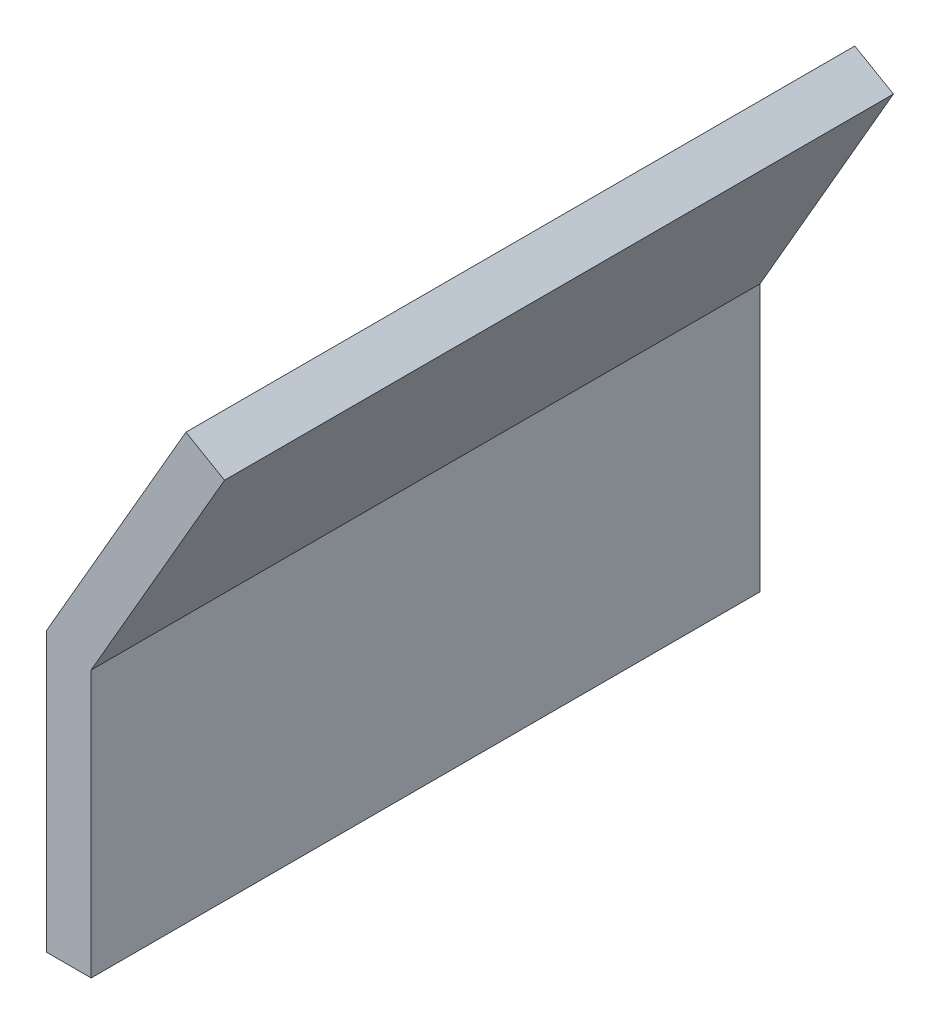
ISO-10303-21;
HEADER;
FILE_DESCRIPTION(('STEP AP214'),'2;1');
FILE_NAME('part.step','',(''),(''),'','','');
FILE_SCHEMA(('AUTOMOTIVE_DESIGN { 1 0 10303 214 1 1 1 1 }'));
ENDSEC;
DATA;
#1=APPLICATION_CONTEXT('core data for automotive mechanical design processes');
#2=APPLICATION_PROTOCOL_DEFINITION('international standard','automotive_design',2000,#1);
#3=PRODUCT_CONTEXT('',#1,'mechanical');
#4=PRODUCT('Part','Part','',(#3));
#5=PRODUCT_RELATED_PRODUCT_CATEGORY('part','',(#4));
#6=PRODUCT_DEFINITION_FORMATION('','',#4);
#7=PRODUCT_DEFINITION_CONTEXT('part definition',#1,'design');
#8=PRODUCT_DEFINITION('design','',#6,#7);
#9=PRODUCT_DEFINITION_SHAPE('','',#8);
#10=(LENGTH_UNIT() NAMED_UNIT(*) SI_UNIT(.MILLI.,.METRE.));
#11=(NAMED_UNIT(*) PLANE_ANGLE_UNIT() SI_UNIT($,.RADIAN.));
#12=(NAMED_UNIT(*) SI_UNIT($,.STERADIAN.) SOLID_ANGLE_UNIT());
#13=UNCERTAINTY_MEASURE_WITH_UNIT(LENGTH_MEASURE(1.E-05),#10,'distance_accuracy_value','');
#14=(GEOMETRIC_REPRESENTATION_CONTEXT(3) GLOBAL_UNCERTAINTY_ASSIGNED_CONTEXT((#13)) GLOBAL_UNIT_ASSIGNED_CONTEXT((#10,
#11,#12)) REPRESENTATION_CONTEXT('',''));
#15=CARTESIAN_POINT('',(0.,0.,0.));
#16=DIRECTION('',(0.,0.,1.));
#17=DIRECTION('',(1.,0.,0.));
#18=AXIS2_PLACEMENT_3D('',#15,#16,#17);
#19=CARTESIAN_POINT('',(0.,0.,60.));
#20=DIRECTION('',(1.,0.,0.));
#21=DIRECTION('',(0.,1.,0.));
#22=AXIS2_PLACEMENT_3D('',#19,#20,#21);
#23=PLANE('',#22);
#24=DIRECTION('',(0.,-1.,0.));
#25=VECTOR('',#24,1.);
#26=CARTESIAN_POINT('',(0.,0.,-60.));
#27=LINE('',#26,#25);
#28=CARTESIAN_POINT('',(0.,0.,-60.));
#29=VERTEX_POINT('',#28);
#30=CARTESIAN_POINT('',(0.,-50.,-60.));
#31=VERTEX_POINT('',#30);
#32=EDGE_CURVE('E134',#29,#31,#27,.T.);
#33=ORIENTED_EDGE('',*,*,#32,.T.);
#34=DIRECTION('',(0.,0.,-1.));
#35=VECTOR('',#34,1.);
#36=CARTESIAN_POINT('',(0.,-50.,60.));
#37=LINE('',#36,#35);
#38=CARTESIAN_POINT('',(0.,-50.,60.));
#39=VERTEX_POINT('',#38);
#40=EDGE_CURVE('E11',#39,#31,#37,.T.);
#41=ORIENTED_EDGE('',*,*,#40,.F.);
#42=DIRECTION('',(0.,-1.,0.));
#43=VECTOR('',#42,1.);
#44=CARTESIAN_POINT('',(0.,0.,60.));
#45=LINE('',#44,#43);
#46=CARTESIAN_POINT('',(0.,0.,60.));
#47=VERTEX_POINT('',#46);
#48=EDGE_CURVE('E150',#47,#39,#45,.T.);
#49=ORIENTED_EDGE('',*,*,#48,.F.);
#50=DIRECTION('',(0.,0.,-1.));
#51=VECTOR('',#50,1.);
#52=CARTESIAN_POINT('',(0.,0.,60.));
#53=LINE('',#52,#51);
#54=EDGE_CURVE('E130',#47,#29,#53,.T.);
#55=ORIENTED_EDGE('',*,*,#54,.T.);
#56=EDGE_LOOP('',(#33,#41,#49,#55));
#57=FACE_BOUND('',#56,.T.);
#58=ADVANCED_FACE('F45',(#57),#23,.F.);
#59=CARTESIAN_POINT('',(0.,-50.,60.));
#60=DIRECTION('',(0.,1.,0.));
#61=DIRECTION('',(0.,0.,1.));
#62=AXIS2_PLACEMENT_3D('',#59,#60,#61);
#63=PLANE('',#62);
#64=DIRECTION('',(1.,0.,0.));
#65=VECTOR('',#64,1.);
#66=CARTESIAN_POINT('',(0.,-50.,-60.));
#67=LINE('',#66,#65);
#68=CARTESIAN_POINT('',(8.00000000000001,-50.,-60.));
#69=VERTEX_POINT('',#68);
#70=EDGE_CURVE('E138',#31,#69,#67,.T.);
#71=ORIENTED_EDGE('',*,*,#70,.T.);
#72=DIRECTION('',(0.,0.,-1.));
#73=VECTOR('',#72,1.);
#74=CARTESIAN_POINT('',(8.00000000000001,-50.,60.));
#75=LINE('',#74,#73);
#76=CARTESIAN_POINT('',(8.00000000000001,-50.,60.));
#77=VERTEX_POINT('',#76);
#78=EDGE_CURVE('E54',#77,#69,#75,.T.);
#79=ORIENTED_EDGE('',*,*,#78,.F.);
#80=DIRECTION('',(1.,0.,0.));
#81=VECTOR('',#80,1.);
#82=CARTESIAN_POINT('',(0.,-50.,60.));
#83=LINE('',#82,#81);
#84=EDGE_CURVE('E99',#39,#77,#83,.T.);
#85=ORIENTED_EDGE('',*,*,#84,.F.);
#86=ORIENTED_EDGE('',*,*,#40,.T.);
#87=EDGE_LOOP('',(#71,#79,#85,#86));
#88=FACE_BOUND('',#87,.T.);
#89=ADVANCED_FACE('F178',(#88),#63,.F.);
#90=CARTESIAN_POINT('',(8.,-2.14359353944895,60.));
#91=DIRECTION('',(-1.,0.,0.));
#92=DIRECTION('',(0.,-1.,0.));
#93=AXIS2_PLACEMENT_3D('',#90,#91,#92);
#94=PLANE('',#93);
#95=DIRECTION('',(0.,1.,0.));
#96=VECTOR('',#95,1.);
#97=CARTESIAN_POINT('',(8.,-2.14359353944895,-60.));
#98=LINE('',#97,#96);
#99=CARTESIAN_POINT('',(8.,-2.14359353944895,-60.));
#100=VERTEX_POINT('',#99);
#101=EDGE_CURVE('E141',#69,#100,#98,.T.);
#102=ORIENTED_EDGE('',*,*,#101,.T.);
#103=DIRECTION('',(0.,0.,-1.));
#104=VECTOR('',#103,1.);
#105=CARTESIAN_POINT('',(8.,-2.14359353944895,60.));
#106=LINE('',#105,#104);
#107=CARTESIAN_POINT('',(8.,-2.14359353944895,60.));
#108=VERTEX_POINT('',#107);
#109=EDGE_CURVE('E123',#108,#100,#106,.T.);
#110=ORIENTED_EDGE('',*,*,#109,.F.);
#111=DIRECTION('',(0.,1.,0.));
#112=VECTOR('',#111,1.);
#113=CARTESIAN_POINT('',(8.,-2.14359353944895,60.));
#114=LINE('',#113,#112);
#115=EDGE_CURVE('E112',#77,#108,#114,.T.);
#116=ORIENTED_EDGE('',*,*,#115,.F.);
#117=ORIENTED_EDGE('',*,*,#78,.T.);
#118=EDGE_LOOP('',(#102,#110,#116,#117));
#119=FACE_BOUND('',#118,.T.);
#120=ADVANCED_FACE('F160',(#119),#94,.F.);
#121=CARTESIAN_POINT('',(8.,-2.14359353944895,60.));
#122=DIRECTION('',(-0.866025403784442,0.499999999999995,0.));
#123=DIRECTION('',(-0.499999999999995,-0.866025403784442,0.));
#124=AXIS2_PLACEMENT_3D('',#121,#122,#123);
#125=PLANE('',#124);
#126=DIRECTION('',(0.499999999999995,0.866025403784442,0.));
#127=VECTOR('',#126,1.);
#128=CARTESIAN_POINT('',(8.,-2.14359353944895,-60.));
#129=LINE('',#128,#127);
#130=CARTESIAN_POINT('',(31.9282032302753,39.3012701892221,-60.));
#131=VERTEX_POINT('',#130);
#132=EDGE_CURVE('E121',#100,#131,#129,.T.);
#133=ORIENTED_EDGE('',*,*,#132,.T.);
#134=DIRECTION('',(0.,0.,-1.));
#135=VECTOR('',#134,1.);
#136=CARTESIAN_POINT('',(31.9282032302753,39.3012701892221,60.));
#137=LINE('',#136,#135);
#138=CARTESIAN_POINT('',(31.9282032302753,39.3012701892221,60.));
#139=VERTEX_POINT('',#138);
#140=EDGE_CURVE('E118',#139,#131,#137,.T.);
#141=ORIENTED_EDGE('',*,*,#140,.F.);
#142=DIRECTION('',(0.499999999999995,0.866025403784442,0.));
#143=VECTOR('',#142,1.);
#144=CARTESIAN_POINT('',(8.,-2.14359353944895,60.));
#145=LINE('',#144,#143);
#146=EDGE_CURVE('E106',#108,#139,#145,.T.);
#147=ORIENTED_EDGE('',*,*,#146,.F.);
#148=ORIENTED_EDGE('',*,*,#109,.T.);
#149=EDGE_LOOP('',(#133,#141,#147,#148));
#150=FACE_BOUND('',#149,.T.);
#151=ADVANCED_FACE('F119',(#150),#125,.F.);
#152=CARTESIAN_POINT('',(24.9999999999997,43.3012701892221,60.));
#153=DIRECTION('',(-0.499999999999996,-0.866025403784441,0.));
#154=DIRECTION('',(0.866025403784441,-0.499999999999996,0.));
#155=AXIS2_PLACEMENT_3D('',#152,#153,#154);
#156=PLANE('',#155);
#157=DIRECTION('',(-0.866025403784441,0.499999999999996,0.));
#158=VECTOR('',#157,1.);
#159=CARTESIAN_POINT('',(24.9999999999997,43.3012701892221,-60.));
#160=LINE('',#159,#158);
#161=CARTESIAN_POINT('',(24.9999999999997,43.3012701892221,-60.));
#162=VERTEX_POINT('',#161);
#163=EDGE_CURVE('E85',#131,#162,#160,.T.);
#164=ORIENTED_EDGE('',*,*,#163,.T.);
#165=DIRECTION('',(0.,0.,-1.));
#166=VECTOR('',#165,1.);
#167=CARTESIAN_POINT('',(24.9999999999997,43.3012701892221,60.));
#168=LINE('',#167,#166);
#169=CARTESIAN_POINT('',(24.9999999999997,43.3012701892221,60.));
#170=VERTEX_POINT('',#169);
#171=EDGE_CURVE('E124',#170,#162,#168,.T.);
#172=ORIENTED_EDGE('',*,*,#171,.F.);
#173=DIRECTION('',(-0.866025403784441,0.499999999999996,0.));
#174=VECTOR('',#173,1.);
#175=CARTESIAN_POINT('',(24.9999999999997,43.3012701892221,60.));
#176=LINE('',#175,#174);
#177=EDGE_CURVE('E110',#139,#170,#176,.T.);
#178=ORIENTED_EDGE('',*,*,#177,.F.);
#179=ORIENTED_EDGE('',*,*,#140,.T.);
#180=EDGE_LOOP('',(#164,#172,#178,#179));
#181=FACE_BOUND('',#180,.T.);
#182=ADVANCED_FACE('F126',(#181),#156,.F.);
#183=CARTESIAN_POINT('',(0.,0.,60.));
#184=DIRECTION('',(0.866025403784442,-0.499999999999995,0.));
#185=DIRECTION('',(0.499999999999995,0.866025403784442,0.));
#186=AXIS2_PLACEMENT_3D('',#183,#184,#185);
#187=PLANE('',#186);
#188=DIRECTION('',(-0.499999999999995,-0.866025403784442,0.));
#189=VECTOR('',#188,1.);
#190=CARTESIAN_POINT('',(0.,0.,-60.));
#191=LINE('',#190,#189);
#192=EDGE_CURVE('E91',#162,#29,#191,.T.);
#193=ORIENTED_EDGE('',*,*,#192,.T.);
#194=ORIENTED_EDGE('',*,*,#54,.F.);
#195=DIRECTION('',(-0.499999999999995,-0.866025403784442,0.));
#196=VECTOR('',#195,1.);
#197=CARTESIAN_POINT('',(0.,0.,60.));
#198=LINE('',#197,#196);
#199=EDGE_CURVE('E62',#170,#47,#198,.T.);
#200=ORIENTED_EDGE('',*,*,#199,.F.);
#201=ORIENTED_EDGE('',*,*,#171,.T.);
#202=EDGE_LOOP('',(#193,#194,#200,#201));
#203=FACE_BOUND('',#202,.T.);
#204=ADVANCED_FACE('F167',(#203),#187,.F.);
#205=CARTESIAN_POINT('',(0.,0.,60.));
#206=DIRECTION('',(0.,0.,1.));
#207=DIRECTION('',(1.,0.,0.));
#208=AXIS2_PLACEMENT_3D('',#205,#206,#207);
#209=PLANE('',#208);
#210=ORIENTED_EDGE('',*,*,#48,.T.);
#211=ORIENTED_EDGE('',*,*,#84,.T.);
#212=ORIENTED_EDGE('',*,*,#115,.T.);
#213=ORIENTED_EDGE('',*,*,#146,.T.);
#214=ORIENTED_EDGE('',*,*,#177,.T.);
#215=ORIENTED_EDGE('',*,*,#199,.T.);
#216=EDGE_LOOP('',(#210,#211,#212,#213,#214,#215));
#217=FACE_BOUND('',#216,.T.);
#218=ADVANCED_FACE('F108',(#217),#209,.T.);
#219=CARTESIAN_POINT('',(0.,0.,-60.));
#220=DIRECTION('',(0.,0.,1.));
#221=DIRECTION('',(1.,0.,0.));
#222=AXIS2_PLACEMENT_3D('',#219,#220,#221);
#223=PLANE('',#222);
#224=ORIENTED_EDGE('',*,*,#32,.F.);
#225=ORIENTED_EDGE('',*,*,#192,.F.);
#226=ORIENTED_EDGE('',*,*,#163,.F.);
#227=ORIENTED_EDGE('',*,*,#132,.F.);
#228=ORIENTED_EDGE('',*,*,#101,.F.);
#229=ORIENTED_EDGE('',*,*,#70,.F.);
#230=EDGE_LOOP('',(#224,#225,#226,#227,#228,#229));
#231=FACE_BOUND('',#230,.T.);
#232=ADVANCED_FACE('F163',(#231),#223,.F.);
#233=CLOSED_SHELL('',(#58,#89,#120,#151,#182,#204,#218,#232));
#234=MANIFOLD_SOLID_BREP('B2',#233);
#235=ADVANCED_BREP_SHAPE_REPRESENTATION('',(#18,#234),#14);
#236=SHAPE_DEFINITION_REPRESENTATION(#9,#235);
ENDSEC;
END-ISO-10303-21;
